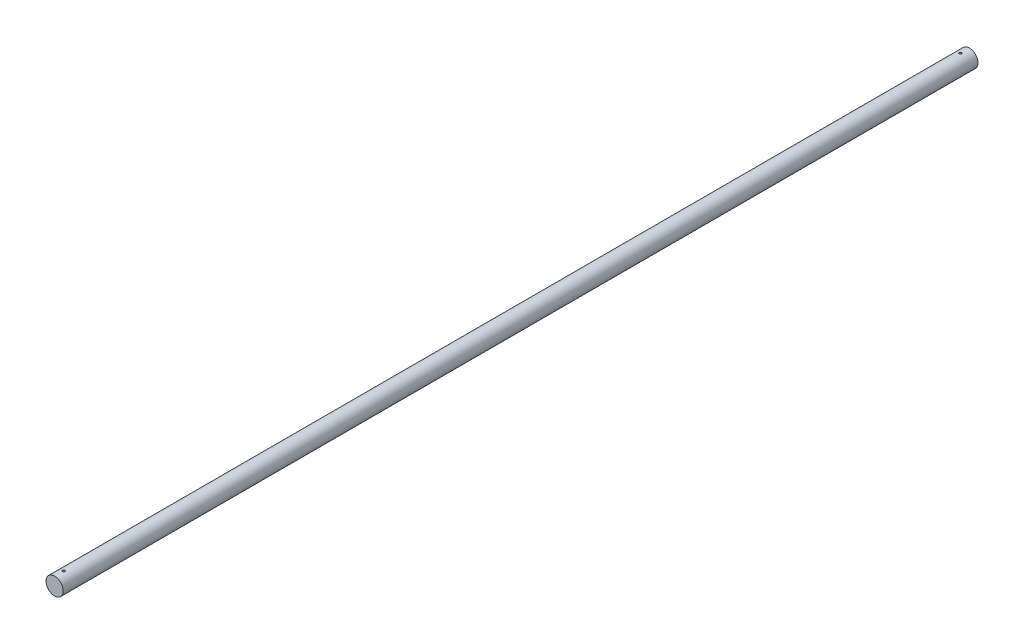
ISO-10303-21;
HEADER;
FILE_DESCRIPTION(('STEP AP214'),'2;1');
FILE_NAME('part.step','',(''),(''),'','','');
FILE_SCHEMA(('AUTOMOTIVE_DESIGN { 1 0 10303 214 1 1 1 1 }'));
ENDSEC;
DATA;
#1=APPLICATION_CONTEXT('core data for automotive mechanical design processes');
#2=APPLICATION_PROTOCOL_DEFINITION('international standard','automotive_design',2000,#1);
#3=PRODUCT_CONTEXT('',#1,'mechanical');
#4=PRODUCT('Part','Part','',(#3));
#5=PRODUCT_RELATED_PRODUCT_CATEGORY('part','',(#4));
#6=PRODUCT_DEFINITION_FORMATION('','',#4);
#7=PRODUCT_DEFINITION_CONTEXT('part definition',#1,'design');
#8=PRODUCT_DEFINITION('design','',#6,#7);
#9=PRODUCT_DEFINITION_SHAPE('','',#8);
#10=(LENGTH_UNIT() NAMED_UNIT(*) SI_UNIT(.MILLI.,.METRE.));
#11=(NAMED_UNIT(*) PLANE_ANGLE_UNIT() SI_UNIT($,.RADIAN.));
#12=(NAMED_UNIT(*) SI_UNIT($,.STERADIAN.) SOLID_ANGLE_UNIT());
#13=UNCERTAINTY_MEASURE_WITH_UNIT(LENGTH_MEASURE(1.E-05),#10,'distance_accuracy_value','');
#14=(GEOMETRIC_REPRESENTATION_CONTEXT(3) GLOBAL_UNCERTAINTY_ASSIGNED_CONTEXT((#13)) GLOBAL_UNIT_ASSIGNED_CONTEXT((#10,
#11,#12)) REPRESENTATION_CONTEXT('',''));
#15=CARTESIAN_POINT('',(0.,0.,0.));
#16=DIRECTION('',(0.,0.,1.));
#17=DIRECTION('',(1.,0.,0.));
#18=AXIS2_PLACEMENT_3D('',#15,#16,#17);
#19=CARTESIAN_POINT('',(0.,0.,294.64));
#20=DIRECTION('',(0.,0.,-1.));
#21=DIRECTION('',(-1.,0.,0.));
#22=AXIS2_PLACEMENT_3D('',#19,#20,#21);
#23=CYLINDRICAL_SURFACE('',#22,5.55625);
#24=CARTESIAN_POINT('',(0.,-5.55625,-288.036));
#25=CARTESIAN_POINT('',(0.0425875021816159,-5.5562493605929,-288.036001786159));
#26=CARTESIAN_POINT('',(0.0852007379201755,-5.55575521063676,-288.039582311802));
#27=CARTESIAN_POINT('',(0.169238961018266,-5.55383149181706,-288.053807810313));
#28=CARTESIAN_POINT('',(0.210662702165726,-5.55240097676972,-288.064459929082));
#29=CARTESIAN_POINT('',(0.291093340917333,-5.54876549903208,-288.092506758243));
#30=CARTESIAN_POINT('',(0.330101935571552,-5.54656108757038,-288.109896670371));
#31=CARTESIAN_POINT('',(0.404640488688186,-5.54162225414125,-288.150914365508));
#32=CARTESIAN_POINT('',(0.440170989749783,-5.53888791504402,-288.174541173399));
#33=CARTESIAN_POINT('',(0.506985191161748,-5.53317383872429,-288.227527827744));
#34=CARTESIAN_POINT('',(0.538242707916452,-5.53019275383218,-288.256920548826));
#35=CARTESIAN_POINT('',(0.59539795653026,-5.52433188975889,-288.320533996162));
#36=CARTESIAN_POINT('',(0.62129539950831,-5.52145211604482,-288.354754982468));
#37=CARTESIAN_POINT('',(0.667095023517692,-5.51610678042398,-288.427226499929));
#38=CARTESIAN_POINT('',(0.686972287560551,-5.5136429582179,-288.465492917209));
#39=CARTESIAN_POINT('',(0.720008139357795,-5.50942659298127,-288.544860364804));
#40=CARTESIAN_POINT('',(0.733167033080304,-5.50767401755984,-288.585961265935));
#41=CARTESIAN_POINT('',(0.752312195899371,-5.50509165241536,-288.669557408075));
#42=CARTESIAN_POINT('',(0.758342983870245,-5.50425613751936,-288.712042273378));
#43=CARTESIAN_POINT('',(0.763198574335488,-5.50358504687739,-288.797428617827));
#44=CARTESIAN_POINT('',(0.762023723823199,-5.50374942298085,-288.840330076812));
#45=CARTESIAN_POINT('',(0.752537855041966,-5.50505430335177,-288.925019586449));
#46=CARTESIAN_POINT('',(0.744276126353132,-5.50618806531769,-288.966813276649));
#47=CARTESIAN_POINT('',(0.720928042941904,-5.50929344912899,-289.048415470322));
#48=CARTESIAN_POINT('',(0.705841524377034,-5.51126509108926,-289.088223926112));
#49=CARTESIAN_POINT('',(0.669219931217206,-5.51583163632021,-289.164877294064));
#50=CARTESIAN_POINT('',(0.647663689143495,-5.51842857983552,-289.201711966828));
#51=CARTESIAN_POINT('',(0.598729661817878,-5.5239515922936,-289.271259876906));
#52=CARTESIAN_POINT('',(0.57135155647395,-5.52687767932886,-289.30397288745));
#53=CARTESIAN_POINT('',(0.511279008852611,-5.53275917438756,-289.364634768064));
#54=CARTESIAN_POINT('',(0.47854213053286,-5.5357146234139,-289.392541627543));
#55=CARTESIAN_POINT('',(0.408826740382625,-5.54129908686246,-289.442471078982));
#56=CARTESIAN_POINT('',(0.371848215065537,-5.54392810024668,-289.464493652232));
#57=CARTESIAN_POINT('',(0.294664957309496,-5.54856559773433,-289.502030404942));
#58=CARTESIAN_POINT('',(0.254458790315291,-5.55057380396915,-289.517541671097));
#59=CARTESIAN_POINT('',(0.171978740370693,-5.55374100077444,-289.541580686209));
#60=CARTESIAN_POINT('',(0.129704974233369,-5.55490003926132,-289.550108829208));
#61=CARTESIAN_POINT('',(0.0446526570422847,-5.55623202672234,-289.559884411853));
#62=CARTESIAN_POINT('',(0.00188086924503712,-5.55641280616181,-289.561189668933));
#63=CARTESIAN_POINT('',(-0.0832712933762653,-5.55578912904729,-289.556635419198));
#64=CARTESIAN_POINT('',(-0.125651678250933,-5.55498469786322,-289.550776096876));
#65=CARTESIAN_POINT('',(-0.208645309974066,-5.55248584190755,-289.532107069778));
#66=CARTESIAN_POINT('',(-0.249264937398506,-5.55079498377447,-289.519325211833));
#67=CARTESIAN_POINT('',(-0.32778438408142,-5.54671240892671,-289.48720308657));
#68=CARTESIAN_POINT('',(-0.365684094135249,-5.54432066409102,-289.4678625561));
#69=CARTESIAN_POINT('',(-0.437944251942013,-5.53908304608236,-289.42303417703));
#70=CARTESIAN_POINT('',(-0.472281506091527,-5.5362344711522,-289.397509263258));
#71=CARTESIAN_POINT('',(-0.536205399765813,-5.53040957353234,-289.341088724106));
#72=CARTESIAN_POINT('',(-0.565791810416935,-5.52743324469679,-289.310192840127));
#73=CARTESIAN_POINT('',(-0.619581744407634,-5.52166381562639,-289.243651416431));
#74=CARTESIAN_POINT('',(-0.6437467378678,-5.51887212057204,-289.207974590459));
#75=CARTESIAN_POINT('',(-0.685740946733356,-5.5138119929335,-289.133034467539));
#76=CARTESIAN_POINT('',(-0.70357031034397,-5.51154354810969,-289.093771254512));
#77=CARTESIAN_POINT('',(-0.732325996836325,-5.50779663349516,-289.012892835701));
#78=CARTESIAN_POINT('',(-0.74327337031971,-5.50631575685588,-288.971285230629));
#79=CARTESIAN_POINT('',(-0.758021765880507,-5.50430498713375,-288.886800469186));
#80=CARTESIAN_POINT('',(-0.761823194246458,-5.50377503998509,-288.843923385133));
#81=CARTESIAN_POINT('',(-0.762163308814817,-5.50372791897283,-288.758500414878));
#82=CARTESIAN_POINT('',(-0.758762545516858,-5.50420230146559,-288.715954761872));
#83=CARTESIAN_POINT('',(-0.74492374563138,-5.50609214468993,-288.632046169958));
#84=CARTESIAN_POINT('',(-0.734485713427642,-5.50750760483529,-288.590683230315));
#85=CARTESIAN_POINT('',(-0.706888776923727,-5.51111734704289,-288.510326286034));
#86=CARTESIAN_POINT('',(-0.689733404974575,-5.51331121971571,-288.471331048756));
#87=CARTESIAN_POINT('',(-0.649194724434225,-5.51823118000241,-288.396762731814));
#88=CARTESIAN_POINT('',(-0.625811275582051,-5.52095727960208,-288.361189729246));
#89=CARTESIAN_POINT('',(-0.573257643303458,-5.52666192053367,-288.294166956597));
#90=CARTESIAN_POINT('',(-0.544042442866608,-5.52964231540136,-288.262752639584));
#91=CARTESIAN_POINT('',(-0.480749393387473,-5.53550377226362,-288.205250156363));
#92=CARTESIAN_POINT('',(-0.446670407764428,-5.53838481084445,-288.179163238548));
#93=CARTESIAN_POINT('',(-0.374435896044651,-5.54373776136351,-288.132951844006));
#94=CARTESIAN_POINT('',(-0.336262441729199,-5.54620774224708,-288.112855177199));
#95=CARTESIAN_POINT('',(-0.257068131066539,-5.55044108050608,-288.07938742296));
#96=CARTESIAN_POINT('',(-0.21605035497497,-5.55220518870573,-288.066009185368));
#97=CARTESIAN_POINT('',(-0.145694158225001,-5.55441315054779,-288.049483332957));
#98=CARTESIAN_POINT('',(-0.116795301143176,-5.55509852977339,-288.044434560559));
#99=CARTESIAN_POINT('',(-0.0586016889923907,-5.5560171723459,-288.037692295531));
#100=CARTESIAN_POINT('',(-0.0293069377093161,-5.55625044001322,-288.03599877084));
#101=CARTESIAN_POINT('',(0.,-5.55625,-288.036));
#102=B_SPLINE_CURVE_WITH_KNOTS('',3,(#24,#25,#26,#27,#28,#29,#30,#31,#32,#33,#34,#35,#36,#37,
#38,#39,#40,#41,#42,#43,#44,#45,#46,#47,#48,#49,#50,#51,#52,#53,#54,#55,#56,#57,#58,#59,#60,#61,
#62,#63,#64,#65,#66,#67,#68,#69,#70,#71,#72,#73,#74,#75,#76,#77,#78,#79,#80,#81,#82,#83,#84,#85,
#86,#87,#88,#89,#90,#91,#92,#93,#94,#95,#96,#97,#98,#99,#100,#101),.UNSPECIFIED.,.T.,.F.,(4,2,2,
2,2,2,2,2,2,2,2,2,2,2,2,2,2,2,2,2,2,2,2,2,2,2,2,2,2,2,2,2,2,2,2,2,2,2,4),(0.,0.127655438641834,
0.255440070859751,0.383133869074846,0.510807714594895,0.639231843338406,0.767662891696116,
0.896618460603429,1.02556815609024,1.15370816236633,1.28184199800534,1.40909181609184,
1.53634468922212,1.6640185297919,1.79169939181636,1.92044516721708,2.04919135198502,
2.17799507941545,2.30679153821365,2.43455550505583,2.56231618194661,2.68956670072792,
2.81682232576077,2.94486037204514,3.07290458476056,3.20183184591423,3.33075609095871,
3.45928403933554,3.58780467993,3.71524910889533,3.84269345847078,3.97007088052455,
4.09745117145624,4.22585567545052,4.35429023459095,4.48331208642463,4.61219633283943,
4.70004430580022,4.78789143927561),.UNSPECIFIED.);
#103=CARTESIAN_POINT('',(0.,-5.55625,-288.036));
#104=VERTEX_POINT('',#103);
#105=EDGE_CURVE('E37',#104,#104,#102,.T.);
#106=ORIENTED_EDGE('',*,*,#105,.T.);
#107=EDGE_LOOP('',(#106));
#108=FACE_BOUND('',#107,.T.);
#109=CARTESIAN_POINT('',(0.,5.55625,-288.036));
#110=CARTESIAN_POINT('',(-0.0425875021816159,5.5562493605929,-288.036001786159));
#111=CARTESIAN_POINT('',(-0.0852007379201755,5.55575521063676,-288.039582311802));
#112=CARTESIAN_POINT('',(-0.169238961018266,5.55383149181706,-288.053807810313));
#113=CARTESIAN_POINT('',(-0.210662702165726,5.55240097676972,-288.064459929082));
#114=CARTESIAN_POINT('',(-0.291093340917333,5.54876549903208,-288.092506758243));
#115=CARTESIAN_POINT('',(-0.330101935571552,5.54656108757038,-288.109896670371));
#116=CARTESIAN_POINT('',(-0.404640488688186,5.54162225414125,-288.150914365508));
#117=CARTESIAN_POINT('',(-0.440170989749783,5.53888791504402,-288.174541173399));
#118=CARTESIAN_POINT('',(-0.506985191161748,5.53317383872429,-288.227527827744));
#119=CARTESIAN_POINT('',(-0.538242707916452,5.53019275383218,-288.256920548826));
#120=CARTESIAN_POINT('',(-0.59539795653026,5.52433188975889,-288.320533996162));
#121=CARTESIAN_POINT('',(-0.62129539950831,5.52145211604482,-288.354754982468));
#122=CARTESIAN_POINT('',(-0.667095023517692,5.51610678042398,-288.427226499929));
#123=CARTESIAN_POINT('',(-0.686972287560551,5.5136429582179,-288.465492917209));
#124=CARTESIAN_POINT('',(-0.720008139357795,5.50942659298127,-288.544860364804));
#125=CARTESIAN_POINT('',(-0.733167033080304,5.50767401755984,-288.585961265935));
#126=CARTESIAN_POINT('',(-0.752312195899371,5.50509165241536,-288.669557408075));
#127=CARTESIAN_POINT('',(-0.758342983870245,5.50425613751936,-288.712042273378));
#128=CARTESIAN_POINT('',(-0.763198574335488,5.50358504687739,-288.797428617827));
#129=CARTESIAN_POINT('',(-0.762023723823199,5.50374942298085,-288.840330076812));
#130=CARTESIAN_POINT('',(-0.752537855041966,5.50505430335177,-288.925019586449));
#131=CARTESIAN_POINT('',(-0.744276126353132,5.50618806531769,-288.966813276649));
#132=CARTESIAN_POINT('',(-0.720928042941904,5.50929344912899,-289.048415470322));
#133=CARTESIAN_POINT('',(-0.705841524377034,5.51126509108926,-289.088223926112));
#134=CARTESIAN_POINT('',(-0.669219931217206,5.51583163632021,-289.164877294064));
#135=CARTESIAN_POINT('',(-0.647663689143495,5.51842857983552,-289.201711966828));
#136=CARTESIAN_POINT('',(-0.598729661817878,5.5239515922936,-289.271259876906));
#137=CARTESIAN_POINT('',(-0.57135155647395,5.52687767932886,-289.30397288745));
#138=CARTESIAN_POINT('',(-0.511279008852611,5.53275917438756,-289.364634768064));
#139=CARTESIAN_POINT('',(-0.47854213053286,5.5357146234139,-289.392541627543));
#140=CARTESIAN_POINT('',(-0.408826740382625,5.54129908686246,-289.442471078982));
#141=CARTESIAN_POINT('',(-0.371848215065537,5.54392810024668,-289.464493652232));
#142=CARTESIAN_POINT('',(-0.294664957309496,5.54856559773433,-289.502030404942));
#143=CARTESIAN_POINT('',(-0.254458790315291,5.55057380396915,-289.517541671097));
#144=CARTESIAN_POINT('',(-0.171978740370693,5.55374100077444,-289.541580686209));
#145=CARTESIAN_POINT('',(-0.129704974233369,5.55490003926132,-289.550108829208));
#146=CARTESIAN_POINT('',(-0.0446526570422847,5.55623202672234,-289.559884411853));
#147=CARTESIAN_POINT('',(-0.00188086924503712,5.55641280616181,-289.561189668933));
#148=CARTESIAN_POINT('',(0.0832712933762653,5.55578912904729,-289.556635419198));
#149=CARTESIAN_POINT('',(0.125651678250933,5.55498469786322,-289.550776096876));
#150=CARTESIAN_POINT('',(0.208645309974066,5.55248584190755,-289.532107069778));
#151=CARTESIAN_POINT('',(0.249264937398506,5.55079498377447,-289.519325211833));
#152=CARTESIAN_POINT('',(0.32778438408142,5.54671240892671,-289.48720308657));
#153=CARTESIAN_POINT('',(0.365684094135249,5.54432066409102,-289.4678625561));
#154=CARTESIAN_POINT('',(0.437944251942013,5.53908304608236,-289.42303417703));
#155=CARTESIAN_POINT('',(0.472281506091527,5.5362344711522,-289.397509263258));
#156=CARTESIAN_POINT('',(0.536205399765813,5.53040957353234,-289.341088724106));
#157=CARTESIAN_POINT('',(0.565791810416935,5.52743324469679,-289.310192840127));
#158=CARTESIAN_POINT('',(0.619581744407634,5.52166381562639,-289.243651416431));
#159=CARTESIAN_POINT('',(0.6437467378678,5.51887212057204,-289.207974590459));
#160=CARTESIAN_POINT('',(0.685740946733356,5.5138119929335,-289.133034467539));
#161=CARTESIAN_POINT('',(0.70357031034397,5.51154354810969,-289.093771254512));
#162=CARTESIAN_POINT('',(0.732325996836325,5.50779663349516,-289.012892835701));
#163=CARTESIAN_POINT('',(0.74327337031971,5.50631575685588,-288.971285230629));
#164=CARTESIAN_POINT('',(0.758021765880507,5.50430498713375,-288.886800469186));
#165=CARTESIAN_POINT('',(0.761823194246458,5.50377503998509,-288.843923385133));
#166=CARTESIAN_POINT('',(0.762163308814817,5.50372791897283,-288.758500414878));
#167=CARTESIAN_POINT('',(0.758762545516858,5.50420230146559,-288.715954761872));
#168=CARTESIAN_POINT('',(0.74492374563138,5.50609214468993,-288.632046169958));
#169=CARTESIAN_POINT('',(0.734485713427642,5.50750760483529,-288.590683230315));
#170=CARTESIAN_POINT('',(0.706888776923727,5.51111734704289,-288.510326286034));
#171=CARTESIAN_POINT('',(0.689733404974575,5.51331121971571,-288.471331048756));
#172=CARTESIAN_POINT('',(0.649194724434225,5.51823118000241,-288.396762731814));
#173=CARTESIAN_POINT('',(0.625811275582051,5.52095727960208,-288.361189729246));
#174=CARTESIAN_POINT('',(0.573257643303458,5.52666192053367,-288.294166956597));
#175=CARTESIAN_POINT('',(0.544042442866608,5.52964231540136,-288.262752639584));
#176=CARTESIAN_POINT('',(0.480749393387473,5.53550377226362,-288.205250156363));
#177=CARTESIAN_POINT('',(0.446670407764428,5.53838481084445,-288.179163238548));
#178=CARTESIAN_POINT('',(0.374435896044651,5.54373776136351,-288.132951844006));
#179=CARTESIAN_POINT('',(0.336262441729199,5.54620774224708,-288.112855177199));
#180=CARTESIAN_POINT('',(0.257068131066539,5.55044108050608,-288.07938742296));
#181=CARTESIAN_POINT('',(0.21605035497497,5.55220518870573,-288.066009185368));
#182=CARTESIAN_POINT('',(0.145694158225001,5.55441315054779,-288.049483332957));
#183=CARTESIAN_POINT('',(0.116795301143176,5.55509852977339,-288.044434560559));
#184=CARTESIAN_POINT('',(0.0586016889923907,5.5560171723459,-288.037692295531));
#185=CARTESIAN_POINT('',(0.0293069377093161,5.55625044001322,-288.03599877084));
#186=CARTESIAN_POINT('',(0.,5.55625,-288.036));
#187=B_SPLINE_CURVE_WITH_KNOTS('',3,(#109,#110,#111,#112,#113,#114,#115,#116,#117,#118,#119,
#120,#121,#122,#123,#124,#125,#126,#127,#128,#129,#130,#131,#132,#133,#134,#135,#136,#137,#138,
#139,#140,#141,#142,#143,#144,#145,#146,#147,#148,#149,#150,#151,#152,#153,#154,#155,#156,#157,
#158,#159,#160,#161,#162,#163,#164,#165,#166,#167,#168,#169,#170,#171,#172,#173,#174,#175,#176,
#177,#178,#179,#180,#181,#182,#183,#184,#185,#186),.UNSPECIFIED.,.T.,.F.,(4,2,2,2,2,2,2,2,2,2,2,
2,2,2,2,2,2,2,2,2,2,2,2,2,2,2,2,2,2,2,2,2,2,2,2,2,2,2,4),(0.,0.127655438641834,
0.255440070859751,0.383133869074846,0.510807714594895,0.639231843338406,0.767662891696116,
0.896618460603429,1.02556815609024,1.15370816236633,1.28184199800534,1.40909181609184,
1.53634468922212,1.6640185297919,1.79169939181636,1.92044516721708,2.04919135198502,
2.17799507941545,2.30679153821365,2.43455550505583,2.56231618194661,2.68956670072792,
2.81682232576077,2.94486037204514,3.07290458476056,3.20183184591423,3.33075609095871,
3.45928403933554,3.58780467993,3.71524910889533,3.84269345847078,3.97007088052455,
4.09745117145624,4.22585567545052,4.35429023459095,4.48331208642463,4.61219633283943,
4.70004430580022,4.78789143927561),.UNSPECIFIED.);
#188=CARTESIAN_POINT('',(0.,5.55625,-288.036));
#189=VERTEX_POINT('',#188);
#190=EDGE_CURVE('E86',#189,#189,#187,.T.);
#191=ORIENTED_EDGE('',*,*,#190,.T.);
#192=EDGE_LOOP('',(#191));
#193=FACE_BOUND('',#192,.T.);
#194=CARTESIAN_POINT('',(0.,-5.55625,289.56));
#195=CARTESIAN_POINT('',(0.0425875021816159,-5.5562493605929,289.559998213841));
#196=CARTESIAN_POINT('',(0.0852007379201755,-5.55575521063676,289.556417688198));
#197=CARTESIAN_POINT('',(0.169238961018266,-5.55383149181706,289.542192189687));
#198=CARTESIAN_POINT('',(0.210662702165726,-5.55240097676972,289.531540070918));
#199=CARTESIAN_POINT('',(0.291093340917333,-5.54876549903208,289.503493241757));
#200=CARTESIAN_POINT('',(0.330101935571552,-5.54656108757038,289.486103329628));
#201=CARTESIAN_POINT('',(0.404640488688186,-5.54162225414125,289.445085634492));
#202=CARTESIAN_POINT('',(0.440170989749783,-5.53888791504402,289.421458826601));
#203=CARTESIAN_POINT('',(0.506985191161748,-5.53317383872429,289.368472172256));
#204=CARTESIAN_POINT('',(0.538242707916452,-5.53019275383218,289.339079451174));
#205=CARTESIAN_POINT('',(0.59539795653026,-5.52433188975889,289.275466003838));
#206=CARTESIAN_POINT('',(0.62129539950831,-5.52145211604482,289.241245017532));
#207=CARTESIAN_POINT('',(0.667095023517692,-5.51610678042398,289.168773500071));
#208=CARTESIAN_POINT('',(0.686972287560551,-5.5136429582179,289.130507082791));
#209=CARTESIAN_POINT('',(0.720008139357795,-5.50942659298127,289.051139635195));
#210=CARTESIAN_POINT('',(0.733167033080304,-5.50767401755984,289.010038734065));
#211=CARTESIAN_POINT('',(0.752312195899375,-5.50509165241536,288.926442591925));
#212=CARTESIAN_POINT('',(0.75834298387025,-5.50425613751936,288.883957726622));
#213=CARTESIAN_POINT('',(0.763198574335487,-5.50358504687739,288.798571382173));
#214=CARTESIAN_POINT('',(0.762023723823197,-5.50374942298085,288.755669923187));
#215=CARTESIAN_POINT('',(0.752537855041966,-5.50505430335177,288.670980413551));
#216=CARTESIAN_POINT('',(0.744276126353132,-5.50618806531769,288.629186723351));
#217=CARTESIAN_POINT('',(0.720928042941904,-5.50929344912899,288.547584529678));
#218=CARTESIAN_POINT('',(0.705841524377034,-5.51126509108926,288.507776073888));
#219=CARTESIAN_POINT('',(0.669219931217206,-5.51583163632021,288.431122705936));
#220=CARTESIAN_POINT('',(0.647663689143494,-5.51842857983552,288.394288033172));
#221=CARTESIAN_POINT('',(0.598729661817879,-5.5239515922936,288.324740123094));
#222=CARTESIAN_POINT('',(0.571351556473953,-5.52687767932886,288.29202711255));
#223=CARTESIAN_POINT('',(0.511279008852604,-5.53275917438756,288.231365231936));
#224=CARTESIAN_POINT('',(0.478542130532841,-5.53571462341391,288.203458372457));
#225=CARTESIAN_POINT('',(0.408826740382604,-5.54129908686246,288.153528921018));
#226=CARTESIAN_POINT('',(0.371848215065528,-5.54392810024668,288.131506347768));
#227=CARTESIAN_POINT('',(0.294664957309499,-5.54856559773433,288.093969595058));
#228=CARTESIAN_POINT('',(0.254458790315292,-5.55057380396915,288.078458328903));
#229=CARTESIAN_POINT('',(0.171978740370692,-5.55374100077444,288.054419313791));
#230=CARTESIAN_POINT('',(0.129704974233369,-5.55490003926132,288.045891170792));
#231=CARTESIAN_POINT('',(0.0446526570422849,-5.55623202672234,288.036115588147));
#232=CARTESIAN_POINT('',(0.00188086924503717,-5.55641280616181,288.034810331067));
#233=CARTESIAN_POINT('',(-0.0832712933762653,-5.55578912904729,288.039364580802));
#234=CARTESIAN_POINT('',(-0.125651678250933,-5.55498469786322,288.045223903123));
#235=CARTESIAN_POINT('',(-0.208645309974066,-5.55248584190755,288.063892930222));
#236=CARTESIAN_POINT('',(-0.249264937398506,-5.55079498377447,288.076674788167));
#237=CARTESIAN_POINT('',(-0.32778438408142,-5.54671240892671,288.10879691343));
#238=CARTESIAN_POINT('',(-0.365684094135249,-5.54432066409102,288.1281374439));
#239=CARTESIAN_POINT('',(-0.437944251942013,-5.53908304608236,288.172965822969));
#240=CARTESIAN_POINT('',(-0.472281506091527,-5.5362344711522,288.198490736742));
#241=CARTESIAN_POINT('',(-0.536205399765813,-5.53040957353234,288.254911275894));
#242=CARTESIAN_POINT('',(-0.565791810416935,-5.52743324469679,288.285807159872));
#243=CARTESIAN_POINT('',(-0.619581744407634,-5.52166381562639,288.352348583569));
#244=CARTESIAN_POINT('',(-0.6437467378678,-5.51887212057204,288.388025409541));
#245=CARTESIAN_POINT('',(-0.685740946733356,-5.5138119929335,288.46296553246));
#246=CARTESIAN_POINT('',(-0.70357031034397,-5.51154354810969,288.502228745488));
#247=CARTESIAN_POINT('',(-0.732325996836325,-5.50779663349516,288.583107164299));
#248=CARTESIAN_POINT('',(-0.74327337031971,-5.50631575685588,288.624714769371));
#249=CARTESIAN_POINT('',(-0.758021765880507,-5.50430498713375,288.709199530814));
#250=CARTESIAN_POINT('',(-0.761823194246458,-5.50377503998509,288.752076614867));
#251=CARTESIAN_POINT('',(-0.762163308814817,-5.50372791897283,288.837499585122));
#252=CARTESIAN_POINT('',(-0.758762545516858,-5.50420230146559,288.880045238128));
#253=CARTESIAN_POINT('',(-0.74492374563138,-5.50609214468993,288.963953830042));
#254=CARTESIAN_POINT('',(-0.734485713427642,-5.50750760483529,289.005316769685));
#255=CARTESIAN_POINT('',(-0.706888776923727,-5.51111734704289,289.085673713966));
#256=CARTESIAN_POINT('',(-0.689733404974576,-5.51331121971571,289.124668951244));
#257=CARTESIAN_POINT('',(-0.649194724434224,-5.51823118000241,289.199237268186));
#258=CARTESIAN_POINT('',(-0.625811275582048,-5.52095727960208,289.234810270754));
#259=CARTESIAN_POINT('',(-0.573257643303466,-5.52666192053367,289.301833043403));
#260=CARTESIAN_POINT('',(-0.54404244286663,-5.52964231540135,289.333247360416));
#261=CARTESIAN_POINT('',(-0.480749393387496,-5.53550377226362,289.390749843636));
#262=CARTESIAN_POINT('',(-0.446670407764437,-5.53838481084444,289.416836761452));
#263=CARTESIAN_POINT('',(-0.374435896044647,-5.54373776136351,289.463048155994));
#264=CARTESIAN_POINT('',(-0.336262441729199,-5.54620774224708,289.4831448228));
#265=CARTESIAN_POINT('',(-0.25706813106654,-5.55044108050608,289.51661257704));
#266=CARTESIAN_POINT('',(-0.21605035497497,-5.55220518870573,289.529990814632));
#267=CARTESIAN_POINT('',(-0.145694158225001,-5.55441315054779,289.546516667043));
#268=CARTESIAN_POINT('',(-0.116795301143176,-5.55509852977339,289.551565439441));
#269=CARTESIAN_POINT('',(-0.0586016889923907,-5.5560171723459,289.558307704469));
#270=CARTESIAN_POINT('',(-0.0293069377093162,-5.55625044001322,289.56000122916));
#271=CARTESIAN_POINT('',(0.,-5.55625,289.56));
#272=B_SPLINE_CURVE_WITH_KNOTS('',3,(#194,#195,#196,#197,#198,#199,#200,#201,#202,#203,#204,
#205,#206,#207,#208,#209,#210,#211,#212,#213,#214,#215,#216,#217,#218,#219,#220,#221,#222,#223,
#224,#225,#226,#227,#228,#229,#230,#231,#232,#233,#234,#235,#236,#237,#238,#239,#240,#241,#242,
#243,#244,#245,#246,#247,#248,#249,#250,#251,#252,#253,#254,#255,#256,#257,#258,#259,#260,#261,
#262,#263,#264,#265,#266,#267,#268,#269,#270,#271),.UNSPECIFIED.,.T.,.F.,(4,2,2,2,2,2,2,2,2,2,2,
2,2,2,2,2,2,2,2,2,2,2,2,2,2,2,2,2,2,2,2,2,2,2,2,2,2,2,4),(0.,0.127655438641834,
0.255440070859751,0.383133869074846,0.510807714594895,0.639231843338406,0.767662891696116,
0.896618460603429,1.02556815609024,1.15370816236638,1.28184199800534,1.40909181609184,
1.53634468922212,1.6640185297919,1.79169939181636,1.9204451672171,2.04919135198502,
2.17799507941545,2.30679153821365,2.43455550505583,2.56231618194661,2.68956670072791,
2.81682232576076,2.94486037204513,3.07290458476055,3.20183184591423,3.33075609095871,
3.45928403933554,3.58780467992999,3.71524910889533,3.84269345847078,3.97007088052454,
4.09745117145624,4.2258556754505,4.35429023459095,4.48331208642463,4.61219633283943,
4.70004430580022,4.78789143927561),.UNSPECIFIED.);
#273=CARTESIAN_POINT('',(0.,-5.55625,289.56));
#274=VERTEX_POINT('',#273);
#275=EDGE_CURVE('E49',#274,#274,#272,.T.);
#276=ORIENTED_EDGE('',*,*,#275,.T.);
#277=EDGE_LOOP('',(#276));
#278=FACE_BOUND('',#277,.T.);
#279=CARTESIAN_POINT('',(0.,5.55625,289.56));
#280=CARTESIAN_POINT('',(-0.0425875021816159,5.5562493605929,289.559998213841));
#281=CARTESIAN_POINT('',(-0.0852007379201755,5.55575521063676,289.556417688198));
#282=CARTESIAN_POINT('',(-0.169238961018266,5.55383149181706,289.542192189687));
#283=CARTESIAN_POINT('',(-0.210662702165726,5.55240097676972,289.531540070918));
#284=CARTESIAN_POINT('',(-0.291093340917333,5.54876549903208,289.503493241757));
#285=CARTESIAN_POINT('',(-0.330101935571552,5.54656108757038,289.486103329628));
#286=CARTESIAN_POINT('',(-0.404640488688186,5.54162225414125,289.445085634492));
#287=CARTESIAN_POINT('',(-0.440170989749783,5.53888791504402,289.421458826601));
#288=CARTESIAN_POINT('',(-0.506985191161748,5.53317383872429,289.368472172256));
#289=CARTESIAN_POINT('',(-0.538242707916452,5.53019275383218,289.339079451174));
#290=CARTESIAN_POINT('',(-0.59539795653026,5.52433188975889,289.275466003838));
#291=CARTESIAN_POINT('',(-0.62129539950831,5.52145211604482,289.241245017532));
#292=CARTESIAN_POINT('',(-0.667095023517692,5.51610678042398,289.168773500071));
#293=CARTESIAN_POINT('',(-0.686972287560551,5.5136429582179,289.130507082791));
#294=CARTESIAN_POINT('',(-0.720008139357795,5.50942659298127,289.051139635195));
#295=CARTESIAN_POINT('',(-0.733167033080304,5.50767401755984,289.010038734065));
#296=CARTESIAN_POINT('',(-0.752312195899375,5.50509165241536,288.926442591925));
#297=CARTESIAN_POINT('',(-0.75834298387025,5.50425613751936,288.883957726622));
#298=CARTESIAN_POINT('',(-0.763198574335487,5.50358504687739,288.798571382173));
#299=CARTESIAN_POINT('',(-0.762023723823197,5.50374942298085,288.755669923187));
#300=CARTESIAN_POINT('',(-0.752537855041966,5.50505430335177,288.670980413551));
#301=CARTESIAN_POINT('',(-0.744276126353132,5.50618806531769,288.629186723351));
#302=CARTESIAN_POINT('',(-0.720928042941904,5.50929344912899,288.547584529678));
#303=CARTESIAN_POINT('',(-0.705841524377034,5.51126509108926,288.507776073888));
#304=CARTESIAN_POINT('',(-0.669219931217206,5.51583163632021,288.431122705936));
#305=CARTESIAN_POINT('',(-0.647663689143494,5.51842857983552,288.394288033172));
#306=CARTESIAN_POINT('',(-0.598729661817879,5.5239515922936,288.324740123094));
#307=CARTESIAN_POINT('',(-0.571351556473953,5.52687767932886,288.29202711255));
#308=CARTESIAN_POINT('',(-0.511279008852604,5.53275917438756,288.231365231936));
#309=CARTESIAN_POINT('',(-0.478542130532841,5.53571462341391,288.203458372457));
#310=CARTESIAN_POINT('',(-0.408826740382604,5.54129908686246,288.153528921018));
#311=CARTESIAN_POINT('',(-0.371848215065528,5.54392810024668,288.131506347768));
#312=CARTESIAN_POINT('',(-0.294664957309499,5.54856559773433,288.093969595058));
#313=CARTESIAN_POINT('',(-0.254458790315292,5.55057380396915,288.078458328903));
#314=CARTESIAN_POINT('',(-0.171978740370692,5.55374100077444,288.054419313791));
#315=CARTESIAN_POINT('',(-0.129704974233369,5.55490003926132,288.045891170792));
#316=CARTESIAN_POINT('',(-0.0446526570422849,5.55623202672234,288.036115588147));
#317=CARTESIAN_POINT('',(-0.00188086924503717,5.55641280616181,288.034810331067));
#318=CARTESIAN_POINT('',(0.0832712933762653,5.55578912904729,288.039364580802));
#319=CARTESIAN_POINT('',(0.125651678250933,5.55498469786322,288.045223903123));
#320=CARTESIAN_POINT('',(0.208645309974066,5.55248584190755,288.063892930222));
#321=CARTESIAN_POINT('',(0.249264937398506,5.55079498377447,288.076674788167));
#322=CARTESIAN_POINT('',(0.32778438408142,5.54671240892671,288.10879691343));
#323=CARTESIAN_POINT('',(0.365684094135249,5.54432066409102,288.1281374439));
#324=CARTESIAN_POINT('',(0.437944251942013,5.53908304608236,288.172965822969));
#325=CARTESIAN_POINT('',(0.472281506091527,5.5362344711522,288.198490736742));
#326=CARTESIAN_POINT('',(0.536205399765813,5.53040957353234,288.254911275894));
#327=CARTESIAN_POINT('',(0.565791810416935,5.52743324469679,288.285807159872));
#328=CARTESIAN_POINT('',(0.619581744407634,5.52166381562639,288.352348583569));
#329=CARTESIAN_POINT('',(0.6437467378678,5.51887212057204,288.388025409541));
#330=CARTESIAN_POINT('',(0.685740946733356,5.5138119929335,288.46296553246));
#331=CARTESIAN_POINT('',(0.70357031034397,5.51154354810969,288.502228745488));
#332=CARTESIAN_POINT('',(0.732325996836325,5.50779663349516,288.583107164299));
#333=CARTESIAN_POINT('',(0.74327337031971,5.50631575685588,288.624714769371));
#334=CARTESIAN_POINT('',(0.758021765880507,5.50430498713375,288.709199530814));
#335=CARTESIAN_POINT('',(0.761823194246458,5.50377503998509,288.752076614867));
#336=CARTESIAN_POINT('',(0.762163308814817,5.50372791897283,288.837499585122));
#337=CARTESIAN_POINT('',(0.758762545516858,5.50420230146559,288.880045238128));
#338=CARTESIAN_POINT('',(0.74492374563138,5.50609214468993,288.963953830042));
#339=CARTESIAN_POINT('',(0.734485713427642,5.50750760483529,289.005316769685));
#340=CARTESIAN_POINT('',(0.706888776923727,5.51111734704289,289.085673713966));
#341=CARTESIAN_POINT('',(0.689733404974576,5.51331121971571,289.124668951244));
#342=CARTESIAN_POINT('',(0.649194724434224,5.51823118000241,289.199237268186));
#343=CARTESIAN_POINT('',(0.625811275582048,5.52095727960208,289.234810270754));
#344=CARTESIAN_POINT('',(0.573257643303466,5.52666192053367,289.301833043403));
#345=CARTESIAN_POINT('',(0.54404244286663,5.52964231540135,289.333247360416));
#346=CARTESIAN_POINT('',(0.480749393387496,5.53550377226362,289.390749843636));
#347=CARTESIAN_POINT('',(0.446670407764437,5.53838481084444,289.416836761452));
#348=CARTESIAN_POINT('',(0.374435896044647,5.54373776136351,289.463048155994));
#349=CARTESIAN_POINT('',(0.336262441729199,5.54620774224708,289.4831448228));
#350=CARTESIAN_POINT('',(0.25706813106654,5.55044108050608,289.51661257704));
#351=CARTESIAN_POINT('',(0.21605035497497,5.55220518870573,289.529990814632));
#352=CARTESIAN_POINT('',(0.145694158225001,5.55441315054779,289.546516667043));
#353=CARTESIAN_POINT('',(0.116795301143176,5.55509852977339,289.551565439441));
#354=CARTESIAN_POINT('',(0.0586016889923907,5.5560171723459,289.558307704469));
#355=CARTESIAN_POINT('',(0.0293069377093162,5.55625044001322,289.56000122916));
#356=CARTESIAN_POINT('',(0.,5.55625,289.56));
#357=B_SPLINE_CURVE_WITH_KNOTS('',3,(#279,#280,#281,#282,#283,#284,#285,#286,#287,#288,#289,
#290,#291,#292,#293,#294,#295,#296,#297,#298,#299,#300,#301,#302,#303,#304,#305,#306,#307,#308,
#309,#310,#311,#312,#313,#314,#315,#316,#317,#318,#319,#320,#321,#322,#323,#324,#325,#326,#327,
#328,#329,#330,#331,#332,#333,#334,#335,#336,#337,#338,#339,#340,#341,#342,#343,#344,#345,#346,
#347,#348,#349,#350,#351,#352,#353,#354,#355,#356),.UNSPECIFIED.,.T.,.F.,(4,2,2,2,2,2,2,2,2,2,2,
2,2,2,2,2,2,2,2,2,2,2,2,2,2,2,2,2,2,2,2,2,2,2,2,2,2,2,4),(0.,0.127655438641834,
0.255440070859751,0.383133869074846,0.510807714594895,0.639231843338406,0.767662891696116,
0.896618460603429,1.02556815609024,1.15370816236638,1.28184199800534,1.40909181609184,
1.53634468922212,1.6640185297919,1.79169939181636,1.9204451672171,2.04919135198502,
2.17799507941545,2.30679153821365,2.43455550505583,2.56231618194661,2.68956670072791,
2.81682232576076,2.94486037204513,3.07290458476055,3.20183184591423,3.33075609095871,
3.45928403933554,3.58780467992999,3.71524910889533,3.84269345847078,3.97007088052454,
4.09745117145624,4.2258556754505,4.35429023459095,4.48331208642463,4.61219633283943,
4.70004430580022,4.78789143927561),.UNSPECIFIED.);
#358=CARTESIAN_POINT('',(0.,5.55625,289.56));
#359=VERTEX_POINT('',#358);
#360=EDGE_CURVE('E52',#359,#359,#357,.T.);
#361=ORIENTED_EDGE('',*,*,#360,.T.);
#362=EDGE_LOOP('',(#361));
#363=FACE_BOUND('',#362,.T.);
#364=CARTESIAN_POINT('',(0.,0.,294.64));
#365=DIRECTION('',(0.,0.,1.));
#366=DIRECTION('',(1.,0.,0.));
#367=AXIS2_PLACEMENT_3D('',#364,#365,#366);
#368=CIRCLE('',#367,5.55625);
#369=CARTESIAN_POINT('',(5.55625,0.,294.64));
#370=VERTEX_POINT('',#369);
#371=EDGE_CURVE('E10',#370,#370,#368,.T.);
#372=ORIENTED_EDGE('',*,*,#371,.F.);
#373=EDGE_LOOP('',(#372));
#374=FACE_BOUND('',#373,.T.);
#375=CARTESIAN_POINT('',(0.,0.,-294.64));
#376=DIRECTION('',(0.,0.,1.));
#377=DIRECTION('',(1.,0.,0.));
#378=AXIS2_PLACEMENT_3D('',#375,#376,#377);
#379=CIRCLE('',#378,5.55625);
#380=CARTESIAN_POINT('',(5.55625,0.,-294.64));
#381=VERTEX_POINT('',#380);
#382=EDGE_CURVE('E44',#381,#381,#379,.T.);
#383=ORIENTED_EDGE('',*,*,#382,.T.);
#384=EDGE_LOOP('',(#383));
#385=FACE_BOUND('',#384,.T.);
#386=ADVANCED_FACE('F33',(#108,#193,#278,#363,#374,#385),#23,.T.);
#387=CARTESIAN_POINT('',(0.,0.,294.64));
#388=DIRECTION('',(0.,0.,1.));
#389=DIRECTION('',(1.,0.,0.));
#390=AXIS2_PLACEMENT_3D('',#387,#388,#389);
#391=PLANE('',#390);
#392=ORIENTED_EDGE('',*,*,#371,.T.);
#393=EDGE_LOOP('',(#392));
#394=FACE_BOUND('',#393,.T.);
#395=ADVANCED_FACE('F68',(#394),#391,.T.);
#396=CARTESIAN_POINT('',(0.,0.,-294.64));
#397=DIRECTION('',(0.,0.,1.));
#398=DIRECTION('',(1.,0.,0.));
#399=AXIS2_PLACEMENT_3D('',#396,#397,#398);
#400=PLANE('',#399);
#401=ORIENTED_EDGE('',*,*,#382,.F.);
#402=EDGE_LOOP('',(#401));
#403=FACE_BOUND('',#402,.T.);
#404=ADVANCED_FACE('F65',(#403),#400,.F.);
#405=CARTESIAN_POINT('',(0.,-6.858,288.798));
#406=DIRECTION('',(0.,1.,0.));
#407=DIRECTION('',(0.,0.,1.));
#408=AXIS2_PLACEMENT_3D('',#405,#406,#407);
#409=CYLINDRICAL_SURFACE('',#408,0.761999999999978);
#410=ORIENTED_EDGE('',*,*,#360,.F.);
#411=EDGE_LOOP('',(#410));
#412=FACE_BOUND('',#411,.T.);
#413=ORIENTED_EDGE('',*,*,#275,.F.);
#414=EDGE_LOOP('',(#413));
#415=FACE_BOUND('',#414,.T.);
#416=ADVANCED_FACE('F60',(#412,#415),#409,.F.);
#417=CARTESIAN_POINT('',(0.,-6.858,-288.798));
#418=DIRECTION('',(0.,1.,0.));
#419=DIRECTION('',(0.,0.,1.));
#420=AXIS2_PLACEMENT_3D('',#417,#418,#419);
#421=CYLINDRICAL_SURFACE('',#420,0.761999999999978);
#422=ORIENTED_EDGE('',*,*,#190,.F.);
#423=EDGE_LOOP('',(#422));
#424=FACE_BOUND('',#423,.T.);
#425=ORIENTED_EDGE('',*,*,#105,.F.);
#426=EDGE_LOOP('',(#425));
#427=FACE_BOUND('',#426,.T.);
#428=ADVANCED_FACE('F64',(#424,#427),#421,.F.);
#429=CLOSED_SHELL('',(#386,#395,#404,#416,#428));
#430=MANIFOLD_SOLID_BREP('B2',#429);
#431=ADVANCED_BREP_SHAPE_REPRESENTATION('',(#18,#430),#14);
#432=SHAPE_DEFINITION_REPRESENTATION(#9,#431);
ENDSEC;
END-ISO-10303-21;
